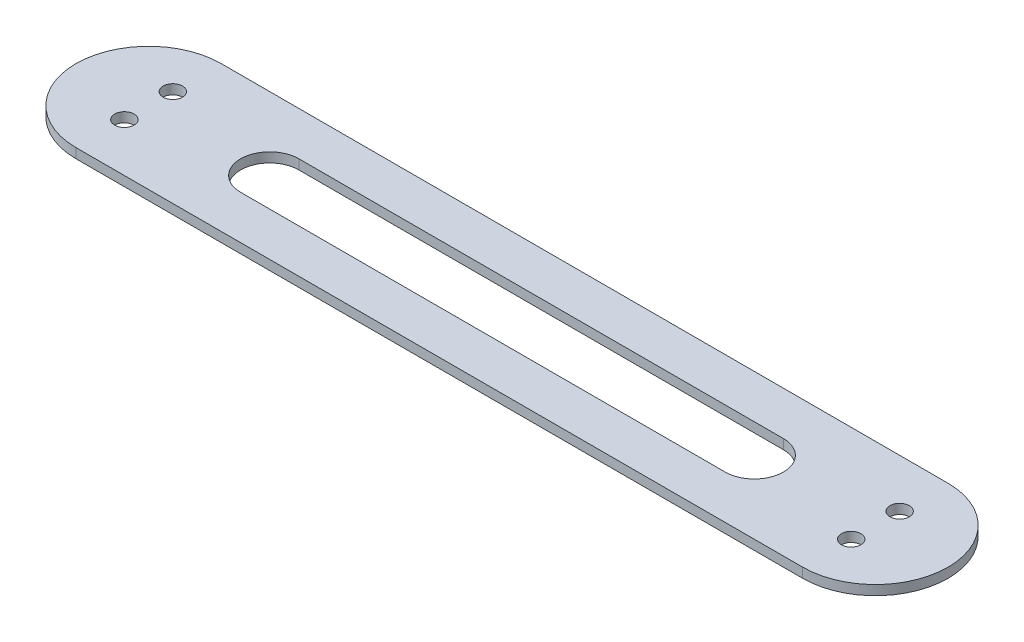
ISO-10303-21;
HEADER;
FILE_DESCRIPTION(('STEP AP214'),'2;1');
FILE_NAME('part.step','',(''),(''),'','','');
FILE_SCHEMA(('AUTOMOTIVE_DESIGN { 1 0 10303 214 1 1 1 1 }'));
ENDSEC;
DATA;
#1=APPLICATION_CONTEXT('core data for automotive mechanical design processes');
#2=APPLICATION_PROTOCOL_DEFINITION('international standard','automotive_design',2000,#1);
#3=PRODUCT_CONTEXT('',#1,'mechanical');
#4=PRODUCT('Part','Part','',(#3));
#5=PRODUCT_RELATED_PRODUCT_CATEGORY('part','',(#4));
#6=PRODUCT_DEFINITION_FORMATION('','',#4);
#7=PRODUCT_DEFINITION_CONTEXT('part definition',#1,'design');
#8=PRODUCT_DEFINITION('design','',#6,#7);
#9=PRODUCT_DEFINITION_SHAPE('','',#8);
#10=(LENGTH_UNIT() NAMED_UNIT(*) SI_UNIT(.MILLI.,.METRE.));
#11=(NAMED_UNIT(*) PLANE_ANGLE_UNIT() SI_UNIT($,.RADIAN.));
#12=(NAMED_UNIT(*) SI_UNIT($,.STERADIAN.) SOLID_ANGLE_UNIT());
#13=UNCERTAINTY_MEASURE_WITH_UNIT(LENGTH_MEASURE(1.E-05),#10,'distance_accuracy_value','');
#14=(GEOMETRIC_REPRESENTATION_CONTEXT(3) GLOBAL_UNCERTAINTY_ASSIGNED_CONTEXT((#13)) GLOBAL_UNIT_ASSIGNED_CONTEXT((#10,
#11,#12)) REPRESENTATION_CONTEXT('',''));
#15=CARTESIAN_POINT('',(0.,0.,0.));
#16=DIRECTION('',(0.,0.,1.));
#17=DIRECTION('',(1.,0.,0.));
#18=AXIS2_PLACEMENT_3D('',#15,#16,#17);
#19=CARTESIAN_POINT('',(-75.,2.,0.));
#20=DIRECTION('',(0.,-1.,0.));
#21=DIRECTION('',(0.,0.,-1.));
#22=AXIS2_PLACEMENT_3D('',#19,#20,#21);
#23=CYLINDRICAL_SURFACE('',#22,15.);
#24=CARTESIAN_POINT('',(-75.,0.,0.));
#25=DIRECTION('',(0.,1.,0.));
#26=DIRECTION('',(0.,0.,1.));
#27=AXIS2_PLACEMENT_3D('',#24,#25,#26);
#28=CIRCLE('',#27,15.);
#29=CARTESIAN_POINT('',(-75.,0.,-15.));
#30=VERTEX_POINT('',#29);
#31=CARTESIAN_POINT('',(-75.,0.,15.));
#32=VERTEX_POINT('',#31);
#33=EDGE_CURVE('E175',#30,#32,#28,.T.);
#34=ORIENTED_EDGE('',*,*,#33,.T.);
#35=DIRECTION('',(0.,-1.,0.));
#36=VECTOR('',#35,1.);
#37=CARTESIAN_POINT('',(-75.,2.,15.));
#38=LINE('',#37,#36);
#39=CARTESIAN_POINT('',(-75.,2.,15.));
#40=VERTEX_POINT('',#39);
#41=EDGE_CURVE('E11',#40,#32,#38,.T.);
#42=ORIENTED_EDGE('',*,*,#41,.F.);
#43=CARTESIAN_POINT('',(-75.,2.,0.));
#44=DIRECTION('',(0.,1.,0.));
#45=DIRECTION('',(0.,0.,1.));
#46=AXIS2_PLACEMENT_3D('',#43,#44,#45);
#47=CIRCLE('',#46,15.);
#48=CARTESIAN_POINT('',(-75.,2.,-15.));
#49=VERTEX_POINT('',#48);
#50=EDGE_CURVE('E179',#49,#40,#47,.T.);
#51=ORIENTED_EDGE('',*,*,#50,.F.);
#52=DIRECTION('',(0.,-1.,0.));
#53=VECTOR('',#52,1.);
#54=CARTESIAN_POINT('',(-75.,2.,-15.));
#55=LINE('',#54,#53);
#56=EDGE_CURVE('E193',#49,#30,#55,.T.);
#57=ORIENTED_EDGE('',*,*,#56,.T.);
#58=EDGE_LOOP('',(#34,#42,#51,#57));
#59=FACE_BOUND('',#58,.T.);
#60=ADVANCED_FACE('F43',(#59),#23,.T.);
#61=CARTESIAN_POINT('',(-75.,2.,15.));
#62=DIRECTION('',(0.,0.,-1.));
#63=DIRECTION('',(-1.,0.,0.));
#64=AXIS2_PLACEMENT_3D('',#61,#62,#63);
#65=PLANE('',#64);
#66=DIRECTION('',(1.,0.,0.));
#67=VECTOR('',#66,1.);
#68=CARTESIAN_POINT('',(-75.,0.,15.));
#69=LINE('',#68,#67);
#70=CARTESIAN_POINT('',(75.,0.,15.));
#71=VERTEX_POINT('',#70);
#72=EDGE_CURVE('E197',#32,#71,#69,.T.);
#73=ORIENTED_EDGE('',*,*,#72,.T.);
#74=DIRECTION('',(0.,-1.,0.));
#75=VECTOR('',#74,1.);
#76=CARTESIAN_POINT('',(75.,2.,15.));
#77=LINE('',#76,#75);
#78=CARTESIAN_POINT('',(75.,2.,15.));
#79=VERTEX_POINT('',#78);
#80=EDGE_CURVE('E51',#79,#71,#77,.T.);
#81=ORIENTED_EDGE('',*,*,#80,.F.);
#82=DIRECTION('',(1.,0.,0.));
#83=VECTOR('',#82,1.);
#84=CARTESIAN_POINT('',(-75.,2.,15.));
#85=LINE('',#84,#83);
#86=EDGE_CURVE('E183',#40,#79,#85,.T.);
#87=ORIENTED_EDGE('',*,*,#86,.F.);
#88=ORIENTED_EDGE('',*,*,#41,.T.);
#89=EDGE_LOOP('',(#73,#81,#87,#88));
#90=FACE_BOUND('',#89,.T.);
#91=ADVANCED_FACE('F232',(#90),#65,.F.);
#92=CARTESIAN_POINT('',(75.,2.,0.));
#93=DIRECTION('',(0.,-1.,0.));
#94=DIRECTION('',(0.,0.,-1.));
#95=AXIS2_PLACEMENT_3D('',#92,#93,#94);
#96=CYLINDRICAL_SURFACE('',#95,15.);
#97=CARTESIAN_POINT('',(75.,0.,0.));
#98=DIRECTION('',(0.,1.,0.));
#99=DIRECTION('',(0.,0.,1.));
#100=AXIS2_PLACEMENT_3D('',#97,#98,#99);
#101=CIRCLE('',#100,15.);
#102=CARTESIAN_POINT('',(75.,0.,-15.));
#103=VERTEX_POINT('',#102);
#104=EDGE_CURVE('E200',#71,#103,#101,.T.);
#105=ORIENTED_EDGE('',*,*,#104,.T.);
#106=DIRECTION('',(0.,-1.,0.));
#107=VECTOR('',#106,1.);
#108=CARTESIAN_POINT('',(75.,2.,-15.));
#109=LINE('',#108,#107);
#110=CARTESIAN_POINT('',(75.,2.,-15.));
#111=VERTEX_POINT('',#110);
#112=EDGE_CURVE('E208',#111,#103,#109,.T.);
#113=ORIENTED_EDGE('',*,*,#112,.F.);
#114=CARTESIAN_POINT('',(75.,2.,0.));
#115=DIRECTION('',(0.,1.,0.));
#116=DIRECTION('',(0.,0.,1.));
#117=AXIS2_PLACEMENT_3D('',#114,#115,#116);
#118=CIRCLE('',#117,15.);
#119=EDGE_CURVE('E187',#79,#111,#118,.T.);
#120=ORIENTED_EDGE('',*,*,#119,.F.);
#121=ORIENTED_EDGE('',*,*,#80,.T.);
#122=EDGE_LOOP('',(#105,#113,#120,#121));
#123=FACE_BOUND('',#122,.T.);
#124=ADVANCED_FACE('F217',(#123),#96,.T.);
#125=CARTESIAN_POINT('',(-75.,2.,-15.));
#126=DIRECTION('',(0.,0.,1.));
#127=DIRECTION('',(1.,0.,0.));
#128=AXIS2_PLACEMENT_3D('',#125,#126,#127);
#129=PLANE('',#128);
#130=DIRECTION('',(-1.,0.,0.));
#131=VECTOR('',#130,1.);
#132=CARTESIAN_POINT('',(-75.,0.,-15.));
#133=LINE('',#132,#131);
#134=EDGE_CURVE('E184',#103,#30,#133,.T.);
#135=ORIENTED_EDGE('',*,*,#134,.T.);
#136=ORIENTED_EDGE('',*,*,#56,.F.);
#137=DIRECTION('',(-1.,0.,0.));
#138=VECTOR('',#137,1.);
#139=CARTESIAN_POINT('',(-75.,2.,-15.));
#140=LINE('',#139,#138);
#141=EDGE_CURVE('E190',#111,#49,#140,.T.);
#142=ORIENTED_EDGE('',*,*,#141,.F.);
#143=ORIENTED_EDGE('',*,*,#112,.T.);
#144=EDGE_LOOP('',(#135,#136,#142,#143));
#145=FACE_BOUND('',#144,.T.);
#146=ADVANCED_FACE('F226',(#145),#129,.F.);
#147=CARTESIAN_POINT('',(-75.,2.,0.));
#148=DIRECTION('',(0.,1.,0.));
#149=DIRECTION('',(0.,0.,1.));
#150=AXIS2_PLACEMENT_3D('',#147,#148,#149);
#151=PLANE('',#150);
#152=CARTESIAN_POINT('',(-75.,2.,5.));
#153=DIRECTION('',(0.,1.,0.));
#154=DIRECTION('',(0.,0.,-1.));
#155=AXIS2_PLACEMENT_3D('',#152,#153,#154);
#156=CIRCLE('',#155,2.);
#157=CARTESIAN_POINT('',(-75.,2.,3.));
#158=VERTEX_POINT('',#157);
#159=EDGE_CURVE('E154',#158,#158,#156,.T.);
#160=ORIENTED_EDGE('',*,*,#159,.F.);
#161=EDGE_LOOP('',(#160));
#162=FACE_BOUND('',#161,.T.);
#163=CARTESIAN_POINT('',(75.,2.,4.99999999999998));
#164=DIRECTION('',(0.,1.,0.));
#165=DIRECTION('',(0.,0.,1.));
#166=AXIS2_PLACEMENT_3D('',#163,#164,#165);
#167=CIRCLE('',#166,2.);
#168=CARTESIAN_POINT('',(75.,2.,6.99999999999998));
#169=VERTEX_POINT('',#168);
#170=EDGE_CURVE('E163',#169,#169,#167,.T.);
#171=ORIENTED_EDGE('',*,*,#170,.F.);
#172=EDGE_LOOP('',(#171));
#173=FACE_BOUND('',#172,.T.);
#174=CARTESIAN_POINT('',(75.,2.,-5.00000000000002));
#175=DIRECTION('',(0.,1.,0.));
#176=DIRECTION('',(0.,0.,-1.));
#177=AXIS2_PLACEMENT_3D('',#174,#175,#176);
#178=CIRCLE('',#177,2.);
#179=CARTESIAN_POINT('',(75.,2.,-7.00000000000002));
#180=VERTEX_POINT('',#179);
#181=EDGE_CURVE('E137',#180,#180,#178,.T.);
#182=ORIENTED_EDGE('',*,*,#181,.F.);
#183=EDGE_LOOP('',(#182));
#184=FACE_BOUND('',#183,.T.);
#185=CARTESIAN_POINT('',(-50.,2.,0.));
#186=DIRECTION('',(0.,1.,0.));
#187=DIRECTION('',(0.,0.,1.));
#188=AXIS2_PLACEMENT_3D('',#185,#186,#187);
#189=CIRCLE('',#188,6.);
#190=CARTESIAN_POINT('',(-50.,2.,-6.00000000000001));
#191=VERTEX_POINT('',#190);
#192=CARTESIAN_POINT('',(-50.,2.,5.99999999999999));
#193=VERTEX_POINT('',#192);
#194=EDGE_CURVE('E58',#191,#193,#189,.T.);
#195=ORIENTED_EDGE('',*,*,#194,.F.);
#196=DIRECTION('',(-1.,0.,0.));
#197=VECTOR('',#196,1.);
#198=CARTESIAN_POINT('',(-50.,2.,-6.00000000000001));
#199=LINE('',#198,#197);
#200=CARTESIAN_POINT('',(50.,2.,-6.00000000000001));
#201=VERTEX_POINT('',#200);
#202=EDGE_CURVE('E118',#201,#191,#199,.T.);
#203=ORIENTED_EDGE('',*,*,#202,.F.);
#204=CARTESIAN_POINT('',(50.,2.,0.));
#205=DIRECTION('',(0.,1.,0.));
#206=DIRECTION('',(0.,0.,1.));
#207=AXIS2_PLACEMENT_3D('',#204,#205,#206);
#208=CIRCLE('',#207,6.);
#209=CARTESIAN_POINT('',(50.,2.,5.99999999999998));
#210=VERTEX_POINT('',#209);
#211=EDGE_CURVE('E124',#210,#201,#208,.T.);
#212=ORIENTED_EDGE('',*,*,#211,.F.);
#213=DIRECTION('',(1.,0.,0.));
#214=VECTOR('',#213,1.);
#215=CARTESIAN_POINT('',(-50.,2.,5.99999999999999));
#216=LINE('',#215,#214);
#217=EDGE_CURVE('E130',#193,#210,#216,.T.);
#218=ORIENTED_EDGE('',*,*,#217,.F.);
#219=EDGE_LOOP('',(#195,#203,#212,#218));
#220=FACE_BOUND('',#219,.T.);
#221=CARTESIAN_POINT('',(-75.,2.,-5.));
#222=DIRECTION('',(0.,1.,0.));
#223=DIRECTION('',(0.,0.,1.));
#224=AXIS2_PLACEMENT_3D('',#221,#222,#223);
#225=CIRCLE('',#224,2.);
#226=CARTESIAN_POINT('',(-75.,2.,-3.));
#227=VERTEX_POINT('',#226);
#228=EDGE_CURVE('E158',#227,#227,#225,.T.);
#229=ORIENTED_EDGE('',*,*,#228,.F.);
#230=EDGE_LOOP('',(#229));
#231=FACE_BOUND('',#230,.T.);
#232=ORIENTED_EDGE('',*,*,#50,.T.);
#233=ORIENTED_EDGE('',*,*,#86,.T.);
#234=ORIENTED_EDGE('',*,*,#119,.T.);
#235=ORIENTED_EDGE('',*,*,#141,.T.);
#236=EDGE_LOOP('',(#232,#233,#234,#235));
#237=FACE_BOUND('',#236,.T.);
#238=ADVANCED_FACE('F127',(#162,#173,#184,#220,#231,#237),#151,.T.);
#239=CARTESIAN_POINT('',(-75.,0.,0.));
#240=DIRECTION('',(0.,1.,0.));
#241=DIRECTION('',(0.,0.,1.));
#242=AXIS2_PLACEMENT_3D('',#239,#240,#241);
#243=PLANE('',#242);
#244=CARTESIAN_POINT('',(-75.,0.,5.));
#245=DIRECTION('',(0.,1.,0.));
#246=DIRECTION('',(0.,0.,-1.));
#247=AXIS2_PLACEMENT_3D('',#244,#245,#246);
#248=CIRCLE('',#247,2.);
#249=CARTESIAN_POINT('',(-75.,0.,3.));
#250=VERTEX_POINT('',#249);
#251=EDGE_CURVE('E159',#250,#250,#248,.T.);
#252=ORIENTED_EDGE('',*,*,#251,.T.);
#253=EDGE_LOOP('',(#252));
#254=FACE_BOUND('',#253,.T.);
#255=CARTESIAN_POINT('',(75.,0.,4.99999999999998));
#256=DIRECTION('',(0.,1.,0.));
#257=DIRECTION('',(0.,0.,1.));
#258=AXIS2_PLACEMENT_3D('',#255,#256,#257);
#259=CIRCLE('',#258,2.);
#260=CARTESIAN_POINT('',(75.,0.,6.99999999999998));
#261=VERTEX_POINT('',#260);
#262=EDGE_CURVE('E167',#261,#261,#259,.T.);
#263=ORIENTED_EDGE('',*,*,#262,.T.);
#264=EDGE_LOOP('',(#263));
#265=FACE_BOUND('',#264,.T.);
#266=CARTESIAN_POINT('',(75.,0.,-5.00000000000002));
#267=DIRECTION('',(0.,1.,0.));
#268=DIRECTION('',(0.,0.,-1.));
#269=AXIS2_PLACEMENT_3D('',#266,#267,#268);
#270=CIRCLE('',#269,2.);
#271=CARTESIAN_POINT('',(75.,0.,-7.00000000000002));
#272=VERTEX_POINT('',#271);
#273=EDGE_CURVE('E132',#272,#272,#270,.T.);
#274=ORIENTED_EDGE('',*,*,#273,.T.);
#275=EDGE_LOOP('',(#274));
#276=FACE_BOUND('',#275,.T.);
#277=DIRECTION('',(-1.,0.,0.));
#278=VECTOR('',#277,1.);
#279=CARTESIAN_POINT('',(-50.,0.,-6.00000000000001));
#280=LINE('',#279,#278);
#281=CARTESIAN_POINT('',(50.,0.,-6.00000000000001));
#282=VERTEX_POINT('',#281);
#283=CARTESIAN_POINT('',(-50.,0.,-6.00000000000001));
#284=VERTEX_POINT('',#283);
#285=EDGE_CURVE('E142',#282,#284,#280,.T.);
#286=ORIENTED_EDGE('',*,*,#285,.T.);
#287=CARTESIAN_POINT('',(-50.,0.,0.));
#288=DIRECTION('',(0.,1.,0.));
#289=DIRECTION('',(0.,0.,1.));
#290=AXIS2_PLACEMENT_3D('',#287,#288,#289);
#291=CIRCLE('',#290,6.);
#292=CARTESIAN_POINT('',(-50.,0.,5.99999999999999));
#293=VERTEX_POINT('',#292);
#294=EDGE_CURVE('E110',#284,#293,#291,.T.);
#295=ORIENTED_EDGE('',*,*,#294,.T.);
#296=DIRECTION('',(1.,0.,0.));
#297=VECTOR('',#296,1.);
#298=CARTESIAN_POINT('',(-50.,0.,5.99999999999999));
#299=LINE('',#298,#297);
#300=CARTESIAN_POINT('',(50.,0.,5.99999999999999));
#301=VERTEX_POINT('',#300);
#302=EDGE_CURVE('E148',#293,#301,#299,.T.);
#303=ORIENTED_EDGE('',*,*,#302,.T.);
#304=CARTESIAN_POINT('',(50.,0.,0.));
#305=DIRECTION('',(0.,1.,0.));
#306=DIRECTION('',(0.,0.,1.));
#307=AXIS2_PLACEMENT_3D('',#304,#305,#306);
#308=CIRCLE('',#307,6.);
#309=EDGE_CURVE('E66',#301,#282,#308,.T.);
#310=ORIENTED_EDGE('',*,*,#309,.T.);
#311=EDGE_LOOP('',(#286,#295,#303,#310));
#312=FACE_BOUND('',#311,.T.);
#313=CARTESIAN_POINT('',(-75.,0.,-5.));
#314=DIRECTION('',(0.,1.,0.));
#315=DIRECTION('',(0.,0.,1.));
#316=AXIS2_PLACEMENT_3D('',#313,#314,#315);
#317=CIRCLE('',#316,2.);
#318=CARTESIAN_POINT('',(-75.,0.,-3.));
#319=VERTEX_POINT('',#318);
#320=EDGE_CURVE('E171',#319,#319,#317,.T.);
#321=ORIENTED_EDGE('',*,*,#320,.T.);
#322=EDGE_LOOP('',(#321));
#323=FACE_BOUND('',#322,.T.);
#324=ORIENTED_EDGE('',*,*,#33,.F.);
#325=ORIENTED_EDGE('',*,*,#134,.F.);
#326=ORIENTED_EDGE('',*,*,#104,.F.);
#327=ORIENTED_EDGE('',*,*,#72,.F.);
#328=EDGE_LOOP('',(#324,#325,#326,#327));
#329=FACE_BOUND('',#328,.T.);
#330=ADVANCED_FACE('F223',(#254,#265,#276,#312,#323,#329),#243,.F.);
#331=CARTESIAN_POINT('',(-75.,0.,-5.));
#332=DIRECTION('',(0.,1.,0.));
#333=DIRECTION('',(0.,0.,1.));
#334=AXIS2_PLACEMENT_3D('',#331,#332,#333);
#335=CYLINDRICAL_SURFACE('',#334,2.);
#336=ORIENTED_EDGE('',*,*,#320,.F.);
#337=EDGE_LOOP('',(#336));
#338=FACE_BOUND('',#337,.T.);
#339=ORIENTED_EDGE('',*,*,#228,.T.);
#340=EDGE_LOOP('',(#339));
#341=FACE_BOUND('',#340,.T.);
#342=ADVANCED_FACE('F244',(#338,#341),#335,.F.);
#343=CARTESIAN_POINT('',(-50.,0.,0.));
#344=DIRECTION('',(0.,1.,0.));
#345=DIRECTION('',(0.,0.,1.));
#346=AXIS2_PLACEMENT_3D('',#343,#344,#345);
#347=CYLINDRICAL_SURFACE('',#346,6.);
#348=ORIENTED_EDGE('',*,*,#194,.T.);
#349=DIRECTION('',(0.,1.,0.));
#350=VECTOR('',#349,1.);
#351=CARTESIAN_POINT('',(-50.,0.,5.99999999999999));
#352=LINE('',#351,#350);
#353=EDGE_CURVE('E145',#293,#193,#352,.T.);
#354=ORIENTED_EDGE('',*,*,#353,.F.);
#355=ORIENTED_EDGE('',*,*,#294,.F.);
#356=DIRECTION('',(0.,1.,0.));
#357=VECTOR('',#356,1.);
#358=CARTESIAN_POINT('',(-50.,0.,-6.00000000000001));
#359=LINE('',#358,#357);
#360=EDGE_CURVE('E106',#284,#191,#359,.T.);
#361=ORIENTED_EDGE('',*,*,#360,.T.);
#362=EDGE_LOOP('',(#348,#354,#355,#361));
#363=FACE_BOUND('',#362,.T.);
#364=ADVANCED_FACE('F108',(#363),#347,.F.);
#365=CARTESIAN_POINT('',(-50.,0.,-6.00000000000001));
#366=DIRECTION('',(0.,0.,-1.));
#367=DIRECTION('',(-1.,0.,0.));
#368=AXIS2_PLACEMENT_3D('',#365,#366,#367);
#369=PLANE('',#368);
#370=ORIENTED_EDGE('',*,*,#202,.T.);
#371=ORIENTED_EDGE('',*,*,#360,.F.);
#372=ORIENTED_EDGE('',*,*,#285,.F.);
#373=DIRECTION('',(0.,1.,0.));
#374=VECTOR('',#373,1.);
#375=CARTESIAN_POINT('',(50.,0.,-6.00000000000001));
#376=LINE('',#375,#374);
#377=EDGE_CURVE('E115',#282,#201,#376,.T.);
#378=ORIENTED_EDGE('',*,*,#377,.T.);
#379=EDGE_LOOP('',(#370,#371,#372,#378));
#380=FACE_BOUND('',#379,.T.);
#381=ADVANCED_FACE('F119',(#380),#369,.F.);
#382=CARTESIAN_POINT('',(50.,0.,0.));
#383=DIRECTION('',(0.,1.,0.));
#384=DIRECTION('',(0.,0.,1.));
#385=AXIS2_PLACEMENT_3D('',#382,#383,#384);
#386=CYLINDRICAL_SURFACE('',#385,6.);
#387=ORIENTED_EDGE('',*,*,#211,.T.);
#388=ORIENTED_EDGE('',*,*,#377,.F.);
#389=ORIENTED_EDGE('',*,*,#309,.F.);
#390=DIRECTION('',(0.,1.,0.));
#391=VECTOR('',#390,1.);
#392=CARTESIAN_POINT('',(50.,0.,5.99999999999998));
#393=LINE('',#392,#391);
#394=EDGE_CURVE('E286',#301,#210,#393,.T.);
#395=ORIENTED_EDGE('',*,*,#394,.T.);
#396=EDGE_LOOP('',(#387,#388,#389,#395));
#397=FACE_BOUND('',#396,.T.);
#398=ADVANCED_FACE('F263',(#397),#386,.F.);
#399=CARTESIAN_POINT('',(-50.,0.,5.99999999999999));
#400=DIRECTION('',(0.,0.,1.));
#401=DIRECTION('',(1.,0.,0.));
#402=AXIS2_PLACEMENT_3D('',#399,#400,#401);
#403=PLANE('',#402);
#404=ORIENTED_EDGE('',*,*,#217,.T.);
#405=ORIENTED_EDGE('',*,*,#394,.F.);
#406=ORIENTED_EDGE('',*,*,#302,.F.);
#407=ORIENTED_EDGE('',*,*,#353,.T.);
#408=EDGE_LOOP('',(#404,#405,#406,#407));
#409=FACE_BOUND('',#408,.T.);
#410=ADVANCED_FACE('F266',(#409),#403,.F.);
#411=CARTESIAN_POINT('',(75.,0.,-5.00000000000002));
#412=DIRECTION('',(0.,1.,0.));
#413=DIRECTION('',(0.,0.,1.));
#414=AXIS2_PLACEMENT_3D('',#411,#412,#413);
#415=CYLINDRICAL_SURFACE('',#414,2.);
#416=ORIENTED_EDGE('',*,*,#273,.F.);
#417=EDGE_LOOP('',(#416));
#418=FACE_BOUND('',#417,.T.);
#419=ORIENTED_EDGE('',*,*,#181,.T.);
#420=EDGE_LOOP('',(#419));
#421=FACE_BOUND('',#420,.T.);
#422=ADVANCED_FACE('F256',(#418,#421),#415,.F.);
#423=CARTESIAN_POINT('',(75.,0.,4.99999999999998));
#424=DIRECTION('',(0.,1.,0.));
#425=DIRECTION('',(0.,0.,1.));
#426=AXIS2_PLACEMENT_3D('',#423,#424,#425);
#427=CYLINDRICAL_SURFACE('',#426,2.);
#428=ORIENTED_EDGE('',*,*,#262,.F.);
#429=EDGE_LOOP('',(#428));
#430=FACE_BOUND('',#429,.T.);
#431=ORIENTED_EDGE('',*,*,#170,.T.);
#432=EDGE_LOOP('',(#431));
#433=FACE_BOUND('',#432,.T.);
#434=ADVANCED_FACE('F252',(#430,#433),#427,.F.);
#435=CARTESIAN_POINT('',(-75.,0.,5.));
#436=DIRECTION('',(0.,1.,0.));
#437=DIRECTION('',(0.,0.,1.));
#438=AXIS2_PLACEMENT_3D('',#435,#436,#437);
#439=CYLINDRICAL_SURFACE('',#438,2.);
#440=ORIENTED_EDGE('',*,*,#251,.F.);
#441=EDGE_LOOP('',(#440));
#442=FACE_BOUND('',#441,.T.);
#443=ORIENTED_EDGE('',*,*,#159,.T.);
#444=EDGE_LOOP('',(#443));
#445=FACE_BOUND('',#444,.T.);
#446=ADVANCED_FACE('F255',(#442,#445),#439,.F.);
#447=CLOSED_SHELL('',(#60,#91,#124,#146,#238,#330,#342,#364,#381,#398,#410,#422,#434,#446));
#448=MANIFOLD_SOLID_BREP('B2',#447);
#449=ADVANCED_BREP_SHAPE_REPRESENTATION('',(#18,#448),#14);
#450=SHAPE_DEFINITION_REPRESENTATION(#9,#449);
ENDSEC;
END-ISO-10303-21;
